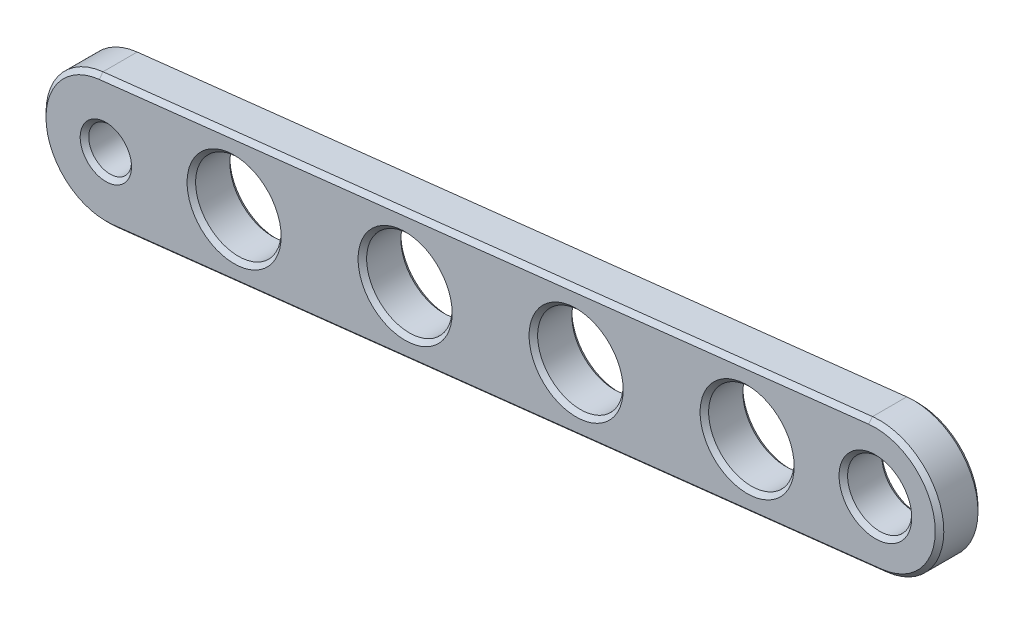
ISO-10303-21;
HEADER;
FILE_DESCRIPTION(('STEP AP214'),'2;1');
FILE_NAME('part.step','',(''),(''),'','','');
FILE_SCHEMA(('AUTOMOTIVE_DESIGN { 1 0 10303 214 1 1 1 1 }'));
ENDSEC;
DATA;
#1=APPLICATION_CONTEXT('core data for automotive mechanical design processes');
#2=APPLICATION_PROTOCOL_DEFINITION('international standard','automotive_design',2000,#1);
#3=PRODUCT_CONTEXT('',#1,'mechanical');
#4=PRODUCT('Part','Part','',(#3));
#5=PRODUCT_RELATED_PRODUCT_CATEGORY('part','',(#4));
#6=PRODUCT_DEFINITION_FORMATION('','',#4);
#7=PRODUCT_DEFINITION_CONTEXT('part definition',#1,'design');
#8=PRODUCT_DEFINITION('design','',#6,#7);
#9=PRODUCT_DEFINITION_SHAPE('','',#8);
#10=(LENGTH_UNIT() NAMED_UNIT(*) SI_UNIT(.MILLI.,.METRE.));
#11=(NAMED_UNIT(*) PLANE_ANGLE_UNIT() SI_UNIT($,.RADIAN.));
#12=(NAMED_UNIT(*) SI_UNIT($,.STERADIAN.) SOLID_ANGLE_UNIT());
#13=UNCERTAINTY_MEASURE_WITH_UNIT(LENGTH_MEASURE(1.E-05),#10,'distance_accuracy_value','');
#14=(GEOMETRIC_REPRESENTATION_CONTEXT(3) GLOBAL_UNCERTAINTY_ASSIGNED_CONTEXT((#13)) GLOBAL_UNIT_ASSIGNED_CONTEXT((#10,
#11,#12)) REPRESENTATION_CONTEXT('',''));
#15=CARTESIAN_POINT('',(0.,0.,0.));
#16=DIRECTION('',(0.,0.,1.));
#17=DIRECTION('',(1.,0.,0.));
#18=AXIS2_PLACEMENT_3D('',#15,#16,#17);
#19=CARTESIAN_POINT('',(145.074626865672,0.,2.));
#20=DIRECTION('',(0.,0.,1.));
#21=DIRECTION('',(1.,0.,0.));
#22=AXIS2_PLACEMENT_3D('',#19,#20,#21);
#23=PLANE('',#22);
#24=CARTESIAN_POINT('',(159.074626865672,1.56716417910449,2.));
#25=DIRECTION('',(0.,0.,1.));
#26=DIRECTION('',(1.,0.,0.));
#27=AXIS2_PLACEMENT_3D('',#24,#25,#26);
#28=CIRCLE('',#27,2.20000000000001);
#29=CARTESIAN_POINT('',(161.274626865672,1.56716417910449,2.));
#30=VERTEX_POINT('',#29);
#31=EDGE_CURVE('E11',#30,#30,#28,.F.);
#32=ORIENTED_EDGE('',*,*,#31,.T.);
#33=EDGE_LOOP('',(#32));
#34=FACE_BOUND('',#33,.T.);
#35=CARTESIAN_POINT('',(175.074626865672,3.3582089552239,2.));
#36=DIRECTION('',(0.,0.,1.));
#37=DIRECTION('',(1.,0.,0.));
#38=AXIS2_PLACEMENT_3D('',#35,#36,#37);
#39=CIRCLE('',#38,2.20000000000001);
#40=CARTESIAN_POINT('',(177.274626865672,3.3582089552239,2.));
#41=VERTEX_POINT('',#40);
#42=EDGE_CURVE('E45',#41,#41,#39,.F.);
#43=ORIENTED_EDGE('',*,*,#42,.T.);
#44=EDGE_LOOP('',(#43));
#45=FACE_BOUND('',#44,.T.);
#46=CARTESIAN_POINT('',(145.074626865672,0.,2.));
#47=DIRECTION('',(0.,0.,1.));
#48=DIRECTION('',(1.,0.,0.));
#49=AXIS2_PLACEMENT_3D('',#46,#47,#48);
#50=CIRCLE('',#49,1.20000000000001);
#51=CARTESIAN_POINT('',(146.274626865672,0.,2.));
#52=VERTEX_POINT('',#51);
#53=EDGE_CURVE('E219',#52,#52,#50,.F.);
#54=ORIENTED_EDGE('',*,*,#53,.T.);
#55=EDGE_LOOP('',(#54));
#56=FACE_BOUND('',#55,.T.);
#57=CARTESIAN_POINT('',(181.074626865672,4.02985074626868,2.));
#58=DIRECTION('',(0.,0.,1.));
#59=DIRECTION('',(1.,0.,0.));
#60=AXIS2_PLACEMENT_3D('',#57,#58,#59);
#61=CIRCLE('',#60,2.79999999999999);
#62=CARTESIAN_POINT('',(181.386114210674,1.24723046424968,2.));
#63=VERTEX_POINT('',#62);
#64=CARTESIAN_POINT('',(180.763139520669,6.81247102828767,2.));
#65=VERTEX_POINT('',#64);
#66=EDGE_CURVE('E53',#63,#65,#61,.T.);
#67=ORIENTED_EDGE('',*,*,#66,.T.);
#68=DIRECTION('',(-0.99379295786393,-0.111245480357903,0.));
#69=VECTOR('',#68,1.);
#70=CARTESIAN_POINT('',(144.76313952067,2.782620282019,2.));
#71=LINE('',#70,#69);
#72=CARTESIAN_POINT('',(144.76313952067,2.78262028201899,2.));
#73=VERTEX_POINT('',#72);
#74=EDGE_CURVE('E217',#65,#73,#71,.T.);
#75=ORIENTED_EDGE('',*,*,#74,.T.);
#76=CARTESIAN_POINT('',(145.074626865672,0.,2.));
#77=DIRECTION('',(0.,0.,1.));
#78=DIRECTION('',(1.,0.,0.));
#79=AXIS2_PLACEMENT_3D('',#76,#77,#78);
#80=CIRCLE('',#79,2.79999999999999);
#81=CARTESIAN_POINT('',(145.386114210674,-2.78262028201899,2.));
#82=VERTEX_POINT('',#81);
#83=EDGE_CURVE('E213',#73,#82,#80,.T.);
#84=ORIENTED_EDGE('',*,*,#83,.T.);
#85=DIRECTION('',(0.99379295786393,0.111245480357903,0.));
#86=VECTOR('',#85,1.);
#87=CARTESIAN_POINT('',(181.386114210674,1.24723046424968,2.));
#88=LINE('',#87,#86);
#89=EDGE_CURVE('E58',#82,#63,#88,.T.);
#90=ORIENTED_EDGE('',*,*,#89,.T.);
#91=EDGE_LOOP('',(#67,#75,#84,#90));
#92=FACE_BOUND('',#91,.T.);
#93=CARTESIAN_POINT('',(181.074626865672,4.02985074626868,2.));
#94=DIRECTION('',(0.,0.,1.));
#95=DIRECTION('',(1.,0.,0.));
#96=AXIS2_PLACEMENT_3D('',#93,#94,#95);
#97=CIRCLE('',#96,1.70000000000001);
#98=CARTESIAN_POINT('',(182.774626865672,4.02985074626868,2.));
#99=VERTEX_POINT('',#98);
#100=EDGE_CURVE('E210',#99,#99,#97,.F.);
#101=ORIENTED_EDGE('',*,*,#100,.T.);
#102=EDGE_LOOP('',(#101));
#103=FACE_BOUND('',#102,.T.);
#104=CARTESIAN_POINT('',(151.074626865672,0.67164179104478,2.));
#105=DIRECTION('',(0.,0.,1.));
#106=DIRECTION('',(1.,0.,0.));
#107=AXIS2_PLACEMENT_3D('',#104,#105,#106);
#108=CIRCLE('',#107,2.20000000000001);
#109=CARTESIAN_POINT('',(153.274626865672,0.67164179104478,2.));
#110=VERTEX_POINT('',#109);
#111=EDGE_CURVE('E207',#110,#110,#108,.F.);
#112=ORIENTED_EDGE('',*,*,#111,.T.);
#113=EDGE_LOOP('',(#112));
#114=FACE_BOUND('',#113,.T.);
#115=CARTESIAN_POINT('',(167.074626865672,2.46268656716419,2.));
#116=DIRECTION('',(0.,0.,1.));
#117=DIRECTION('',(1.,0.,0.));
#118=AXIS2_PLACEMENT_3D('',#115,#116,#117);
#119=CIRCLE('',#118,2.20000000000001);
#120=CARTESIAN_POINT('',(169.274626865672,2.46268656716419,2.));
#121=VERTEX_POINT('',#120);
#122=EDGE_CURVE('E204',#121,#121,#119,.F.);
#123=ORIENTED_EDGE('',*,*,#122,.T.);
#124=EDGE_LOOP('',(#123));
#125=FACE_BOUND('',#124,.T.);
#126=ADVANCED_FACE('F35',(#34,#45,#56,#92,#103,#114,#125),#23,.T.);
#127=CARTESIAN_POINT('',(145.074626865672,0.,0.));
#128=DIRECTION('',(0.,0.,1.));
#129=DIRECTION('',(1.,0.,0.));
#130=AXIS2_PLACEMENT_3D('',#127,#128,#129);
#131=PLANE('',#130);
#132=CARTESIAN_POINT('',(159.074626865672,1.56716417910449,0.));
#133=DIRECTION('',(0.,0.,1.));
#134=DIRECTION('',(1.,0.,0.));
#135=AXIS2_PLACEMENT_3D('',#132,#133,#134);
#136=CIRCLE('',#135,2.20000000000001);
#137=CARTESIAN_POINT('',(161.274626865672,1.56716417910449,0.));
#138=VERTEX_POINT('',#137);
#139=EDGE_CURVE('E149',#138,#138,#136,.T.);
#140=ORIENTED_EDGE('',*,*,#139,.T.);
#141=EDGE_LOOP('',(#140));
#142=FACE_BOUND('',#141,.T.);
#143=CARTESIAN_POINT('',(167.074626865672,2.46268656716419,0.));
#144=DIRECTION('',(0.,0.,1.));
#145=DIRECTION('',(1.,0.,0.));
#146=AXIS2_PLACEMENT_3D('',#143,#144,#145);
#147=CIRCLE('',#146,2.20000000000001);
#148=CARTESIAN_POINT('',(169.274626865672,2.46268656716419,0.));
#149=VERTEX_POINT('',#148);
#150=EDGE_CURVE('E146',#149,#149,#147,.T.);
#151=ORIENTED_EDGE('',*,*,#150,.T.);
#152=EDGE_LOOP('',(#151));
#153=FACE_BOUND('',#152,.T.);
#154=CARTESIAN_POINT('',(175.074626865672,3.3582089552239,0.));
#155=DIRECTION('',(0.,0.,1.));
#156=DIRECTION('',(1.,0.,0.));
#157=AXIS2_PLACEMENT_3D('',#154,#155,#156);
#158=CIRCLE('',#157,2.20000000000001);
#159=CARTESIAN_POINT('',(177.274626865672,3.3582089552239,0.));
#160=VERTEX_POINT('',#159);
#161=EDGE_CURVE('E143',#160,#160,#158,.T.);
#162=ORIENTED_EDGE('',*,*,#161,.T.);
#163=EDGE_LOOP('',(#162));
#164=FACE_BOUND('',#163,.T.);
#165=CARTESIAN_POINT('',(151.074626865672,0.67164179104478,0.));
#166=DIRECTION('',(0.,0.,1.));
#167=DIRECTION('',(1.,0.,0.));
#168=AXIS2_PLACEMENT_3D('',#165,#166,#167);
#169=CIRCLE('',#168,2.20000000000001);
#170=CARTESIAN_POINT('',(153.274626865672,0.67164179104478,0.));
#171=VERTEX_POINT('',#170);
#172=EDGE_CURVE('E140',#171,#171,#169,.T.);
#173=ORIENTED_EDGE('',*,*,#172,.T.);
#174=EDGE_LOOP('',(#173));
#175=FACE_BOUND('',#174,.T.);
#176=CARTESIAN_POINT('',(145.074626865672,0.,0.));
#177=DIRECTION('',(0.,0.,1.));
#178=DIRECTION('',(1.,0.,0.));
#179=AXIS2_PLACEMENT_3D('',#176,#177,#178);
#180=CIRCLE('',#179,1.20000000000001);
#181=CARTESIAN_POINT('',(146.274626865672,0.,0.));
#182=VERTEX_POINT('',#181);
#183=EDGE_CURVE('E133',#182,#182,#180,.T.);
#184=ORIENTED_EDGE('',*,*,#183,.T.);
#185=EDGE_LOOP('',(#184));
#186=FACE_BOUND('',#185,.T.);
#187=CARTESIAN_POINT('',(181.074626865672,4.02985074626868,0.));
#188=DIRECTION('',(0.,0.,1.));
#189=DIRECTION('',(1.,0.,0.));
#190=AXIS2_PLACEMENT_3D('',#187,#188,#189);
#191=CIRCLE('',#190,1.70000000000001);
#192=CARTESIAN_POINT('',(182.774626865672,4.02985074626868,0.));
#193=VERTEX_POINT('',#192);
#194=EDGE_CURVE('E130',#193,#193,#191,.T.);
#195=ORIENTED_EDGE('',*,*,#194,.T.);
#196=EDGE_LOOP('',(#195));
#197=FACE_BOUND('',#196,.T.);
#198=CARTESIAN_POINT('',(181.074626865672,4.02985074626868,0.));
#199=DIRECTION('',(0.,0.,1.));
#200=DIRECTION('',(1.,0.,0.));
#201=AXIS2_PLACEMENT_3D('',#198,#199,#200);
#202=CIRCLE('',#201,2.79999999999999);
#203=CARTESIAN_POINT('',(180.763139520669,6.81247102828768,0.));
#204=VERTEX_POINT('',#203);
#205=CARTESIAN_POINT('',(181.386114210674,1.24723046424968,0.));
#206=VERTEX_POINT('',#205);
#207=EDGE_CURVE('E129',#204,#206,#202,.F.);
#208=ORIENTED_EDGE('',*,*,#207,.T.);
#209=DIRECTION('',(-0.99379295786393,-0.111245480357903,0.));
#210=VECTOR('',#209,1.);
#211=CARTESIAN_POINT('',(145.386114210674,-2.782620282019,0.));
#212=LINE('',#211,#210);
#213=CARTESIAN_POINT('',(145.386114210674,-2.78262028201899,0.));
#214=VERTEX_POINT('',#213);
#215=EDGE_CURVE('E108',#206,#214,#212,.T.);
#216=ORIENTED_EDGE('',*,*,#215,.T.);
#217=CARTESIAN_POINT('',(145.074626865672,0.,0.));
#218=DIRECTION('',(0.,0.,1.));
#219=DIRECTION('',(1.,0.,0.));
#220=AXIS2_PLACEMENT_3D('',#217,#218,#219);
#221=CIRCLE('',#220,2.79999999999999);
#222=CARTESIAN_POINT('',(144.76313952067,2.78262028201899,0.));
#223=VERTEX_POINT('',#222);
#224=EDGE_CURVE('E118',#214,#223,#221,.F.);
#225=ORIENTED_EDGE('',*,*,#224,.T.);
#226=DIRECTION('',(0.99379295786393,0.111245480357903,0.));
#227=VECTOR('',#226,1.);
#228=CARTESIAN_POINT('',(144.76313952067,2.782620282019,0.));
#229=LINE('',#228,#227);
#230=EDGE_CURVE('E124',#223,#204,#229,.T.);
#231=ORIENTED_EDGE('',*,*,#230,.T.);
#232=EDGE_LOOP('',(#208,#216,#225,#231));
#233=FACE_BOUND('',#232,.T.);
#234=ADVANCED_FACE('F127',(#142,#153,#164,#175,#186,#197,#233),#131,.F.);
#235=CARTESIAN_POINT('',(145.074626865672,0.,2.));
#236=DIRECTION('',(0.,0.,-1.));
#237=DIRECTION('',(-1.,0.,0.));
#238=AXIS2_PLACEMENT_3D('',#235,#236,#237);
#239=CYLINDRICAL_SURFACE('',#238,2.99999999999999);
#240=DIRECTION('',(0.,0.,-1.));
#241=VECTOR('',#240,1.);
#242=CARTESIAN_POINT('',(144.740890424598,2.98137887359178,2.));
#243=LINE('',#242,#241);
#244=CARTESIAN_POINT('',(144.740890424598,2.98137887359178,1.80000000000001));
#245=VERTEX_POINT('',#244);
#246=CARTESIAN_POINT('',(144.740890424598,2.98137887359178,0.199999999999995));
#247=VERTEX_POINT('',#246);
#248=EDGE_CURVE('E228',#245,#247,#243,.T.);
#249=ORIENTED_EDGE('',*,*,#248,.T.);
#250=CARTESIAN_POINT('',(145.074626865672,0.,0.199999999999995));
#251=DIRECTION('',(0.,0.,1.));
#252=DIRECTION('',(1.,0.,0.));
#253=AXIS2_PLACEMENT_3D('',#250,#251,#252);
#254=CIRCLE('',#253,2.99999999999999);
#255=CARTESIAN_POINT('',(145.408363306745,-2.98137887359177,0.199999999999995));
#256=VERTEX_POINT('',#255);
#257=EDGE_CURVE('E202',#247,#256,#254,.T.);
#258=ORIENTED_EDGE('',*,*,#257,.T.);
#259=DIRECTION('',(0.,0.,-1.));
#260=VECTOR('',#259,1.);
#261=CARTESIAN_POINT('',(145.408363306745,-2.98137887359177,2.));
#262=LINE('',#261,#260);
#263=CARTESIAN_POINT('',(145.408363306745,-2.98137887359177,1.80000000000001));
#264=VERTEX_POINT('',#263);
#265=EDGE_CURVE('E125',#264,#256,#262,.T.);
#266=ORIENTED_EDGE('',*,*,#265,.F.);
#267=CARTESIAN_POINT('',(145.074626865672,0.,1.80000000000001));
#268=DIRECTION('',(0.,0.,1.));
#269=DIRECTION('',(1.,0.,0.));
#270=AXIS2_PLACEMENT_3D('',#267,#268,#269);
#271=CIRCLE('',#270,2.99999999999999);
#272=EDGE_CURVE('E200',#264,#245,#271,.F.);
#273=ORIENTED_EDGE('',*,*,#272,.T.);
#274=EDGE_LOOP('',(#249,#258,#266,#273));
#275=FACE_BOUND('',#274,.T.);
#276=ADVANCED_FACE('F254',(#275),#239,.T.);
#277=CARTESIAN_POINT('',(145.408363306745,-2.98137887359177,2.));
#278=DIRECTION('',(-0.111245480357903,0.99379295786393,0.));
#279=DIRECTION('',(-0.99379295786393,-0.111245480357903,0.));
#280=AXIS2_PLACEMENT_3D('',#277,#278,#279);
#281=PLANE('',#280);
#282=ORIENTED_EDGE('',*,*,#265,.T.);
#283=DIRECTION('',(0.99379295786393,0.111245480357903,0.));
#284=VECTOR('',#283,1.);
#285=CARTESIAN_POINT('',(145.408363306745,-2.98137887359177,0.199999999999996));
#286=LINE('',#285,#284);
#287=CARTESIAN_POINT('',(181.408363306745,1.0484718726769,0.199999999999995));
#288=VERTEX_POINT('',#287);
#289=EDGE_CURVE('E111',#256,#288,#286,.T.);
#290=ORIENTED_EDGE('',*,*,#289,.T.);
#291=DIRECTION('',(0.,0.,-1.));
#292=VECTOR('',#291,1.);
#293=CARTESIAN_POINT('',(181.408363306745,1.0484718726769,2.));
#294=LINE('',#293,#292);
#295=CARTESIAN_POINT('',(181.408363306745,1.0484718726769,1.80000000000001));
#296=VERTEX_POINT('',#295);
#297=EDGE_CURVE('E251',#296,#288,#294,.T.);
#298=ORIENTED_EDGE('',*,*,#297,.F.);
#299=DIRECTION('',(-0.99379295786393,-0.111245480357903,0.));
#300=VECTOR('',#299,1.);
#301=CARTESIAN_POINT('',(145.408363306745,-2.98137887359177,1.80000000000001));
#302=LINE('',#301,#300);
#303=EDGE_CURVE('E188',#296,#264,#302,.T.);
#304=ORIENTED_EDGE('',*,*,#303,.T.);
#305=EDGE_LOOP('',(#282,#290,#298,#304));
#306=FACE_BOUND('',#305,.T.);
#307=ADVANCED_FACE('F249',(#306),#281,.F.);
#308=CARTESIAN_POINT('',(181.074626865672,4.02985074626868,2.));
#309=DIRECTION('',(0.,0.,-1.));
#310=DIRECTION('',(-1.,0.,0.));
#311=AXIS2_PLACEMENT_3D('',#308,#309,#310);
#312=CYLINDRICAL_SURFACE('',#311,2.99999999999999);
#313=ORIENTED_EDGE('',*,*,#297,.T.);
#314=CARTESIAN_POINT('',(181.074626865672,4.02985074626868,0.199999999999995));
#315=DIRECTION('',(0.,0.,1.));
#316=DIRECTION('',(1.,0.,0.));
#317=AXIS2_PLACEMENT_3D('',#314,#315,#316);
#318=CIRCLE('',#317,2.99999999999999);
#319=CARTESIAN_POINT('',(180.740890424598,7.01122961986046,0.199999999999995));
#320=VERTEX_POINT('',#319);
#321=EDGE_CURVE('E193',#288,#320,#318,.T.);
#322=ORIENTED_EDGE('',*,*,#321,.T.);
#323=DIRECTION('',(0.,0.,-1.));
#324=VECTOR('',#323,1.);
#325=CARTESIAN_POINT('',(180.740890424598,7.01122961986046,2.));
#326=LINE('',#325,#324);
#327=CARTESIAN_POINT('',(180.740890424598,7.01122961986046,1.80000000000001));
#328=VERTEX_POINT('',#327);
#329=EDGE_CURVE('E257',#328,#320,#326,.T.);
#330=ORIENTED_EDGE('',*,*,#329,.F.);
#331=CARTESIAN_POINT('',(181.074626865672,4.02985074626868,1.80000000000001));
#332=DIRECTION('',(0.,0.,1.));
#333=DIRECTION('',(1.,0.,0.));
#334=AXIS2_PLACEMENT_3D('',#331,#332,#333);
#335=CIRCLE('',#334,2.99999999999999);
#336=EDGE_CURVE('E191',#328,#296,#335,.F.);
#337=ORIENTED_EDGE('',*,*,#336,.T.);
#338=EDGE_LOOP('',(#313,#322,#330,#337));
#339=FACE_BOUND('',#338,.T.);
#340=ADVANCED_FACE('F270',(#339),#312,.T.);
#341=CARTESIAN_POINT('',(144.740890424598,2.98137887359178,2.));
#342=DIRECTION('',(0.111245480357903,-0.99379295786393,0.));
#343=DIRECTION('',(0.99379295786393,0.111245480357903,0.));
#344=AXIS2_PLACEMENT_3D('',#341,#342,#343);
#345=PLANE('',#344);
#346=ORIENTED_EDGE('',*,*,#329,.T.);
#347=DIRECTION('',(-0.99379295786393,-0.111245480357903,0.));
#348=VECTOR('',#347,1.);
#349=CARTESIAN_POINT('',(144.740890424598,2.98137887359178,0.199999999999995));
#350=LINE('',#349,#348);
#351=EDGE_CURVE('E198',#320,#247,#350,.T.);
#352=ORIENTED_EDGE('',*,*,#351,.T.);
#353=ORIENTED_EDGE('',*,*,#248,.F.);
#354=DIRECTION('',(0.99379295786393,0.111245480357903,0.));
#355=VECTOR('',#354,1.);
#356=CARTESIAN_POINT('',(180.740890424598,7.01122961986046,1.80000000000001));
#357=LINE('',#356,#355);
#358=EDGE_CURVE('E195',#245,#328,#357,.T.);
#359=ORIENTED_EDGE('',*,*,#358,.T.);
#360=EDGE_LOOP('',(#346,#352,#353,#359));
#361=FACE_BOUND('',#360,.T.);
#362=ADVANCED_FACE('F274',(#361),#345,.F.);
#363=CARTESIAN_POINT('',(181.074626865672,4.02985074626868,2.));
#364=DIRECTION('',(0.,0.,-1.));
#365=DIRECTION('',(-1.,0.,0.));
#366=AXIS2_PLACEMENT_3D('',#363,#364,#365);
#367=CYLINDRICAL_SURFACE('',#366,1.5);
#368=CARTESIAN_POINT('',(181.074626865672,4.02985074626868,0.200000000000008));
#369=DIRECTION('',(0.,0.,1.));
#370=DIRECTION('',(1.,0.,0.));
#371=AXIS2_PLACEMENT_3D('',#368,#369,#370);
#372=CIRCLE('',#371,1.5);
#373=CARTESIAN_POINT('',(182.574626865672,4.02985074626868,0.200000000000008));
#374=VERTEX_POINT('',#373);
#375=EDGE_CURVE('E185',#374,#374,#372,.F.);
#376=ORIENTED_EDGE('',*,*,#375,.T.);
#377=EDGE_LOOP('',(#376));
#378=FACE_BOUND('',#377,.T.);
#379=CARTESIAN_POINT('',(181.074626865672,4.02985074626868,1.8));
#380=DIRECTION('',(0.,0.,1.));
#381=DIRECTION('',(1.,0.,0.));
#382=AXIS2_PLACEMENT_3D('',#379,#380,#381);
#383=CIRCLE('',#382,1.5);
#384=CARTESIAN_POINT('',(182.574626865672,4.02985074626868,1.8));
#385=VERTEX_POINT('',#384);
#386=EDGE_CURVE('E182',#385,#385,#383,.T.);
#387=ORIENTED_EDGE('',*,*,#386,.T.);
#388=EDGE_LOOP('',(#387));
#389=FACE_BOUND('',#388,.T.);
#390=ADVANCED_FACE('F318',(#378,#389),#367,.F.);
#391=CARTESIAN_POINT('',(145.074626865672,0.,2.));
#392=DIRECTION('',(0.,0.,-1.));
#393=DIRECTION('',(-1.,0.,0.));
#394=AXIS2_PLACEMENT_3D('',#391,#392,#393);
#395=CYLINDRICAL_SURFACE('',#394,0.999999999999998);
#396=CARTESIAN_POINT('',(145.074626865672,0.,0.200000000000009));
#397=DIRECTION('',(0.,0.,1.));
#398=DIRECTION('',(1.,0.,0.));
#399=AXIS2_PLACEMENT_3D('',#396,#397,#398);
#400=CIRCLE('',#399,0.999999999999998);
#401=CARTESIAN_POINT('',(146.074626865672,0.,0.200000000000009));
#402=VERTEX_POINT('',#401);
#403=EDGE_CURVE('E179',#402,#402,#400,.F.);
#404=ORIENTED_EDGE('',*,*,#403,.T.);
#405=EDGE_LOOP('',(#404));
#406=FACE_BOUND('',#405,.T.);
#407=CARTESIAN_POINT('',(145.074626865672,0.,1.79999999999999));
#408=DIRECTION('',(0.,0.,1.));
#409=DIRECTION('',(1.,0.,0.));
#410=AXIS2_PLACEMENT_3D('',#407,#408,#409);
#411=CIRCLE('',#410,0.999999999999998);
#412=CARTESIAN_POINT('',(146.074626865672,0.,1.79999999999999));
#413=VERTEX_POINT('',#412);
#414=EDGE_CURVE('E176',#413,#413,#411,.T.);
#415=ORIENTED_EDGE('',*,*,#414,.T.);
#416=EDGE_LOOP('',(#415));
#417=FACE_BOUND('',#416,.T.);
#418=ADVANCED_FACE('F314',(#406,#417),#395,.F.);
#419=CARTESIAN_POINT('',(151.074626865672,0.67164179104478,2.));
#420=DIRECTION('',(0.,0.,-1.));
#421=DIRECTION('',(-1.,0.,0.));
#422=AXIS2_PLACEMENT_3D('',#419,#420,#421);
#423=CYLINDRICAL_SURFACE('',#422,2.);
#424=CARTESIAN_POINT('',(151.074626865672,0.67164179104478,0.200000000000008));
#425=DIRECTION('',(0.,0.,1.));
#426=DIRECTION('',(1.,0.,0.));
#427=AXIS2_PLACEMENT_3D('',#424,#425,#426);
#428=CIRCLE('',#427,2.);
#429=CARTESIAN_POINT('',(153.074626865672,0.67164179104478,0.200000000000008));
#430=VERTEX_POINT('',#429);
#431=EDGE_CURVE('E173',#430,#430,#428,.F.);
#432=ORIENTED_EDGE('',*,*,#431,.T.);
#433=EDGE_LOOP('',(#432));
#434=FACE_BOUND('',#433,.T.);
#435=CARTESIAN_POINT('',(151.074626865672,0.67164179104478,1.79999999999999));
#436=DIRECTION('',(0.,0.,1.));
#437=DIRECTION('',(1.,0.,0.));
#438=AXIS2_PLACEMENT_3D('',#435,#436,#437);
#439=CIRCLE('',#438,2.);
#440=CARTESIAN_POINT('',(153.074626865672,0.67164179104478,1.79999999999999));
#441=VERTEX_POINT('',#440);
#442=EDGE_CURVE('E170',#441,#441,#439,.T.);
#443=ORIENTED_EDGE('',*,*,#442,.T.);
#444=EDGE_LOOP('',(#443));
#445=FACE_BOUND('',#444,.T.);
#446=ADVANCED_FACE('F308',(#434,#445),#423,.F.);
#447=CARTESIAN_POINT('',(175.074626865672,3.3582089552239,2.));
#448=DIRECTION('',(0.,0.,-1.));
#449=DIRECTION('',(-1.,0.,0.));
#450=AXIS2_PLACEMENT_3D('',#447,#448,#449);
#451=CYLINDRICAL_SURFACE('',#450,2.);
#452=CARTESIAN_POINT('',(175.074626865672,3.3582089552239,0.200000000000008));
#453=DIRECTION('',(0.,0.,1.));
#454=DIRECTION('',(1.,0.,0.));
#455=AXIS2_PLACEMENT_3D('',#452,#453,#454);
#456=CIRCLE('',#455,2.);
#457=CARTESIAN_POINT('',(177.074626865672,3.3582089552239,0.200000000000008));
#458=VERTEX_POINT('',#457);
#459=EDGE_CURVE('E167',#458,#458,#456,.F.);
#460=ORIENTED_EDGE('',*,*,#459,.T.);
#461=EDGE_LOOP('',(#460));
#462=FACE_BOUND('',#461,.T.);
#463=CARTESIAN_POINT('',(175.074626865672,3.3582089552239,1.8));
#464=DIRECTION('',(0.,0.,1.));
#465=DIRECTION('',(1.,0.,0.));
#466=AXIS2_PLACEMENT_3D('',#463,#464,#465);
#467=CIRCLE('',#466,2.);
#468=CARTESIAN_POINT('',(177.074626865672,3.3582089552239,1.8));
#469=VERTEX_POINT('',#468);
#470=EDGE_CURVE('E164',#469,#469,#467,.T.);
#471=ORIENTED_EDGE('',*,*,#470,.T.);
#472=EDGE_LOOP('',(#471));
#473=FACE_BOUND('',#472,.T.);
#474=ADVANCED_FACE('F298',(#462,#473),#451,.F.);
#475=CARTESIAN_POINT('',(167.074626865672,2.46268656716419,2.));
#476=DIRECTION('',(0.,0.,-1.));
#477=DIRECTION('',(-1.,0.,0.));
#478=AXIS2_PLACEMENT_3D('',#475,#476,#477);
#479=CYLINDRICAL_SURFACE('',#478,2.);
#480=CARTESIAN_POINT('',(167.074626865672,2.46268656716419,0.200000000000008));
#481=DIRECTION('',(0.,0.,1.));
#482=DIRECTION('',(1.,0.,0.));
#483=AXIS2_PLACEMENT_3D('',#480,#481,#482);
#484=CIRCLE('',#483,2.);
#485=CARTESIAN_POINT('',(169.074626865672,2.46268656716419,0.200000000000008));
#486=VERTEX_POINT('',#485);
#487=EDGE_CURVE('E161',#486,#486,#484,.F.);
#488=ORIENTED_EDGE('',*,*,#487,.T.);
#489=EDGE_LOOP('',(#488));
#490=FACE_BOUND('',#489,.T.);
#491=CARTESIAN_POINT('',(167.074626865672,2.46268656716419,1.8));
#492=DIRECTION('',(0.,0.,1.));
#493=DIRECTION('',(1.,0.,0.));
#494=AXIS2_PLACEMENT_3D('',#491,#492,#493);
#495=CIRCLE('',#494,2.);
#496=CARTESIAN_POINT('',(169.074626865672,2.46268656716419,1.8));
#497=VERTEX_POINT('',#496);
#498=EDGE_CURVE('E158',#497,#497,#495,.T.);
#499=ORIENTED_EDGE('',*,*,#498,.T.);
#500=EDGE_LOOP('',(#499));
#501=FACE_BOUND('',#500,.T.);
#502=ADVANCED_FACE('F295',(#490,#501),#479,.F.);
#503=CARTESIAN_POINT('',(159.074626865672,1.56716417910449,2.));
#504=DIRECTION('',(0.,0.,-1.));
#505=DIRECTION('',(-1.,0.,0.));
#506=AXIS2_PLACEMENT_3D('',#503,#504,#505);
#507=CYLINDRICAL_SURFACE('',#506,2.);
#508=CARTESIAN_POINT('',(159.074626865672,1.56716417910449,0.200000000000008));
#509=DIRECTION('',(0.,0.,1.));
#510=DIRECTION('',(1.,0.,0.));
#511=AXIS2_PLACEMENT_3D('',#508,#509,#510);
#512=CIRCLE('',#511,2.);
#513=CARTESIAN_POINT('',(161.074626865672,1.56716417910449,0.200000000000008));
#514=VERTEX_POINT('',#513);
#515=EDGE_CURVE('E155',#514,#514,#512,.F.);
#516=ORIENTED_EDGE('',*,*,#515,.T.);
#517=EDGE_LOOP('',(#516));
#518=FACE_BOUND('',#517,.T.);
#519=CARTESIAN_POINT('',(159.074626865672,1.56716417910449,1.8));
#520=DIRECTION('',(0.,0.,1.));
#521=DIRECTION('',(1.,0.,0.));
#522=AXIS2_PLACEMENT_3D('',#519,#520,#521);
#523=CIRCLE('',#522,2.);
#524=CARTESIAN_POINT('',(161.074626865672,1.56716417910449,1.8));
#525=VERTEX_POINT('',#524);
#526=EDGE_CURVE('E152',#525,#525,#523,.T.);
#527=ORIENTED_EDGE('',*,*,#526,.T.);
#528=EDGE_LOOP('',(#527));
#529=FACE_BOUND('',#528,.T.);
#530=ADVANCED_FACE('F297',(#518,#529),#507,.F.);
#531=CARTESIAN_POINT('',(159.074626865672,1.56716417910449,0.));
#532=DIRECTION('',(0.,0.,-1.));
#533=DIRECTION('',(-1.,0.,0.));
#534=AXIS2_PLACEMENT_3D('',#531,#532,#533);
#535=CONICAL_SURFACE('',#534,2.20000000000001,0.785398163397457);
#536=ORIENTED_EDGE('',*,*,#515,.F.);
#537=EDGE_LOOP('',(#536));
#538=FACE_BOUND('',#537,.T.);
#539=ORIENTED_EDGE('',*,*,#139,.F.);
#540=EDGE_LOOP('',(#539));
#541=FACE_BOUND('',#540,.T.);
#542=ADVANCED_FACE('F305',(#538,#541),#535,.F.);
#543=CARTESIAN_POINT('',(167.074626865672,2.46268656716419,0.));
#544=DIRECTION('',(0.,0.,-1.));
#545=DIRECTION('',(-1.,0.,0.));
#546=AXIS2_PLACEMENT_3D('',#543,#544,#545);
#547=CONICAL_SURFACE('',#546,2.20000000000001,0.785398163397457);
#548=ORIENTED_EDGE('',*,*,#487,.F.);
#549=EDGE_LOOP('',(#548));
#550=FACE_BOUND('',#549,.T.);
#551=ORIENTED_EDGE('',*,*,#150,.F.);
#552=EDGE_LOOP('',(#551));
#553=FACE_BOUND('',#552,.T.);
#554=ADVANCED_FACE('F340',(#550,#553),#547,.F.);
#555=CARTESIAN_POINT('',(175.074626865672,3.3582089552239,0.));
#556=DIRECTION('',(0.,0.,-1.));
#557=DIRECTION('',(-1.,0.,0.));
#558=AXIS2_PLACEMENT_3D('',#555,#556,#557);
#559=CONICAL_SURFACE('',#558,2.20000000000001,0.785398163397457);
#560=ORIENTED_EDGE('',*,*,#459,.F.);
#561=EDGE_LOOP('',(#560));
#562=FACE_BOUND('',#561,.T.);
#563=ORIENTED_EDGE('',*,*,#161,.F.);
#564=EDGE_LOOP('',(#563));
#565=FACE_BOUND('',#564,.T.);
#566=ADVANCED_FACE('F347',(#562,#565),#559,.F.);
#567=CARTESIAN_POINT('',(151.074626865672,0.67164179104478,0.));
#568=DIRECTION('',(0.,0.,-1.));
#569=DIRECTION('',(-1.,0.,0.));
#570=AXIS2_PLACEMENT_3D('',#567,#568,#569);
#571=CONICAL_SURFACE('',#570,2.20000000000001,0.785398163397457);
#572=ORIENTED_EDGE('',*,*,#431,.F.);
#573=EDGE_LOOP('',(#572));
#574=FACE_BOUND('',#573,.T.);
#575=ORIENTED_EDGE('',*,*,#172,.F.);
#576=EDGE_LOOP('',(#575));
#577=FACE_BOUND('',#576,.T.);
#578=ADVANCED_FACE('F354',(#574,#577),#571,.F.);
#579=CARTESIAN_POINT('',(145.074626865672,0.,0.));
#580=DIRECTION('',(0.,0.,-1.));
#581=DIRECTION('',(-1.,0.,0.));
#582=AXIS2_PLACEMENT_3D('',#579,#580,#581);
#583=CONICAL_SURFACE('',#582,1.20000000000001,0.785398163397448);
#584=ORIENTED_EDGE('',*,*,#403,.F.);
#585=EDGE_LOOP('',(#584));
#586=FACE_BOUND('',#585,.T.);
#587=ORIENTED_EDGE('',*,*,#183,.F.);
#588=EDGE_LOOP('',(#587));
#589=FACE_BOUND('',#588,.T.);
#590=ADVANCED_FACE('F361',(#586,#589),#583,.F.);
#591=CARTESIAN_POINT('',(181.074626865672,4.02985074626868,0.));
#592=DIRECTION('',(0.,0.,-1.));
#593=DIRECTION('',(-1.,0.,0.));
#594=AXIS2_PLACEMENT_3D('',#591,#592,#593);
#595=CONICAL_SURFACE('',#594,1.70000000000001,0.785398163397452);
#596=ORIENTED_EDGE('',*,*,#375,.F.);
#597=EDGE_LOOP('',(#596));
#598=FACE_BOUND('',#597,.T.);
#599=ORIENTED_EDGE('',*,*,#194,.F.);
#600=EDGE_LOOP('',(#599));
#601=FACE_BOUND('',#600,.T.);
#602=ADVANCED_FACE('F368',(#598,#601),#595,.F.);
#603=CARTESIAN_POINT('',(144.740890424598,2.98137887359178,0.199999999999995));
#604=DIRECTION('',(0.0786624335374285,-0.702717739601023,0.707106781186546));
#605=DIRECTION('',(-0.99379295786393,-0.111245480357903,0.));
#606=AXIS2_PLACEMENT_3D('',#603,#604,#605);
#607=PLANE('',#606);
#608=DIRECTION('',(-0.0786624335373901,0.702717739601026,0.707106781186548));
#609=VECTOR('',#608,1.);
#610=CARTESIAN_POINT('',(180.763139520669,6.81247102828768,0.));
#611=LINE('',#610,#609);
#612=EDGE_CURVE('E114',#204,#320,#611,.T.);
#613=ORIENTED_EDGE('',*,*,#612,.F.);
#614=ORIENTED_EDGE('',*,*,#230,.F.);
#615=DIRECTION('',(0.0786624335373901,-0.702717739601026,-0.707106781186548));
#616=VECTOR('',#615,1.);
#617=CARTESIAN_POINT('',(144.740890424598,2.98137887359178,0.199999999999995));
#618=LINE('',#617,#616);
#619=EDGE_CURVE('E121',#247,#223,#618,.T.);
#620=ORIENTED_EDGE('',*,*,#619,.F.);
#621=ORIENTED_EDGE('',*,*,#351,.F.);
#622=EDGE_LOOP('',(#613,#614,#620,#621));
#623=FACE_BOUND('',#622,.T.);
#624=ADVANCED_FACE('F263',(#623),#607,.F.);
#625=CARTESIAN_POINT('',(145.074626865672,0.,0.199999999999995));
#626=DIRECTION('',(0.,0.,1.));
#627=DIRECTION('',(1.,0.,0.));
#628=AXIS2_PLACEMENT_3D('',#625,#626,#627);
#629=CONICAL_SURFACE('',#628,2.99999999999999,0.785398163397454);
#630=ORIENTED_EDGE('',*,*,#619,.T.);
#631=ORIENTED_EDGE('',*,*,#224,.F.);
#632=DIRECTION('',(-0.0786624335373897,0.70271773960103,-0.707106781186544));
#633=VECTOR('',#632,1.);
#634=CARTESIAN_POINT('',(145.408363306745,-2.98137887359178,0.199999999999995));
#635=LINE('',#634,#633);
#636=EDGE_CURVE('E104',#256,#214,#635,.T.);
#637=ORIENTED_EDGE('',*,*,#636,.F.);
#638=ORIENTED_EDGE('',*,*,#257,.F.);
#639=EDGE_LOOP('',(#630,#631,#637,#638));
#640=FACE_BOUND('',#639,.T.);
#641=ADVANCED_FACE('F119',(#640),#629,.T.);
#642=CARTESIAN_POINT('',(181.074626865672,4.02985074626868,0.199999999999995));
#643=DIRECTION('',(0.,0.,1.));
#644=DIRECTION('',(1.,0.,0.));
#645=AXIS2_PLACEMENT_3D('',#642,#643,#644);
#646=CONICAL_SURFACE('',#645,2.99999999999999,0.785398163397455);
#647=ORIENTED_EDGE('',*,*,#612,.T.);
#648=ORIENTED_EDGE('',*,*,#321,.F.);
#649=DIRECTION('',(0.0786624335373896,-0.70271773960103,0.707106781186543));
#650=VECTOR('',#649,1.);
#651=CARTESIAN_POINT('',(181.386114210674,1.24723046424968,0.));
#652=LINE('',#651,#650);
#653=EDGE_CURVE('E115',#206,#288,#652,.T.);
#654=ORIENTED_EDGE('',*,*,#653,.F.);
#655=ORIENTED_EDGE('',*,*,#207,.F.);
#656=EDGE_LOOP('',(#647,#648,#654,#655));
#657=FACE_BOUND('',#656,.T.);
#658=ADVANCED_FACE('F266',(#657),#646,.T.);
#659=CARTESIAN_POINT('',(145.408363306745,-2.98137887359177,0.199999999999995));
#660=DIRECTION('',(-0.0786624335374285,0.702717739601023,0.707106781186546));
#661=DIRECTION('',(0.99379295786393,0.111245480357903,0.));
#662=AXIS2_PLACEMENT_3D('',#659,#660,#661);
#663=PLANE('',#662);
#664=ORIENTED_EDGE('',*,*,#636,.T.);
#665=ORIENTED_EDGE('',*,*,#215,.F.);
#666=ORIENTED_EDGE('',*,*,#653,.T.);
#667=ORIENTED_EDGE('',*,*,#289,.F.);
#668=EDGE_LOOP('',(#664,#665,#666,#667));
#669=FACE_BOUND('',#668,.T.);
#670=ADVANCED_FACE('F106',(#669),#663,.F.);
#671=CARTESIAN_POINT('',(159.074626865672,1.56716417910449,1.8));
#672=DIRECTION('',(0.,0.,1.));
#673=DIRECTION('',(1.,0.,0.));
#674=AXIS2_PLACEMENT_3D('',#671,#672,#673);
#675=CONICAL_SURFACE('',#674,2.,0.785398163397474);
#676=ORIENTED_EDGE('',*,*,#31,.F.);
#677=EDGE_LOOP('',(#676));
#678=FACE_BOUND('',#677,.T.);
#679=ORIENTED_EDGE('',*,*,#526,.F.);
#680=EDGE_LOOP('',(#679));
#681=FACE_BOUND('',#680,.T.);
#682=ADVANCED_FACE('F383',(#678,#681),#675,.F.);
#683=CARTESIAN_POINT('',(175.074626865672,3.3582089552239,1.8));
#684=DIRECTION('',(0.,0.,1.));
#685=DIRECTION('',(1.,0.,0.));
#686=AXIS2_PLACEMENT_3D('',#683,#684,#685);
#687=CONICAL_SURFACE('',#686,2.,0.785398163397474);
#688=ORIENTED_EDGE('',*,*,#42,.F.);
#689=EDGE_LOOP('',(#688));
#690=FACE_BOUND('',#689,.T.);
#691=ORIENTED_EDGE('',*,*,#470,.F.);
#692=EDGE_LOOP('',(#691));
#693=FACE_BOUND('',#692,.T.);
#694=ADVANCED_FACE('F402',(#690,#693),#687,.F.);
#695=CARTESIAN_POINT('',(145.074626865672,0.,1.79999999999999));
#696=DIRECTION('',(0.,0.,1.));
#697=DIRECTION('',(1.,0.,0.));
#698=AXIS2_PLACEMENT_3D('',#695,#696,#697);
#699=CONICAL_SURFACE('',#698,0.999999999999998,0.785398163397453);
#700=ORIENTED_EDGE('',*,*,#53,.F.);
#701=EDGE_LOOP('',(#700));
#702=FACE_BOUND('',#701,.T.);
#703=ORIENTED_EDGE('',*,*,#414,.F.);
#704=EDGE_LOOP('',(#703));
#705=FACE_BOUND('',#704,.T.);
#706=ADVANCED_FACE('F409',(#702,#705),#699,.F.);
#707=CARTESIAN_POINT('',(145.386114210674,-2.78262028201899,2.));
#708=DIRECTION('',(0.0786624335374271,-0.702717739601011,0.707106781186559));
#709=DIRECTION('',(-0.99379295786393,-0.111245480357903,0.));
#710=AXIS2_PLACEMENT_3D('',#707,#708,#709);
#711=PLANE('',#710);
#712=DIRECTION('',(-0.0786624335373914,0.702717739601037,0.707106781186536));
#713=VECTOR('',#712,1.);
#714=CARTESIAN_POINT('',(145.408363306745,-2.98137887359177,1.80000000000001));
#715=LINE('',#714,#713);
#716=EDGE_CURVE('E232',#264,#82,#715,.T.);
#717=ORIENTED_EDGE('',*,*,#716,.F.);
#718=ORIENTED_EDGE('',*,*,#303,.F.);
#719=DIRECTION('',(0.0786624335373914,-0.702717739601037,-0.707106781186536));
#720=VECTOR('',#719,1.);
#721=CARTESIAN_POINT('',(181.386114210674,1.24723046424968,2.));
#722=LINE('',#721,#720);
#723=EDGE_CURVE('E40',#63,#296,#722,.T.);
#724=ORIENTED_EDGE('',*,*,#723,.F.);
#725=ORIENTED_EDGE('',*,*,#89,.F.);
#726=EDGE_LOOP('',(#717,#718,#724,#725));
#727=FACE_BOUND('',#726,.T.);
#728=ADVANCED_FACE('F244',(#727),#711,.T.);
#729=CARTESIAN_POINT('',(181.074626865672,4.02985074626868,2.));
#730=DIRECTION('',(0.,0.,-1.));
#731=DIRECTION('',(-1.,0.,0.));
#732=AXIS2_PLACEMENT_3D('',#729,#730,#731);
#733=CONICAL_SURFACE('',#732,2.79999999999999,0.785398163397471);
#734=ORIENTED_EDGE('',*,*,#723,.T.);
#735=ORIENTED_EDGE('',*,*,#336,.F.);
#736=DIRECTION('',(-0.0786624335373909,0.702717739601042,-0.707106781186532));
#737=VECTOR('',#736,1.);
#738=CARTESIAN_POINT('',(180.763139520669,6.81247102828767,2.));
#739=LINE('',#738,#737);
#740=EDGE_CURVE('E231',#65,#328,#739,.T.);
#741=ORIENTED_EDGE('',*,*,#740,.F.);
#742=ORIENTED_EDGE('',*,*,#66,.F.);
#743=EDGE_LOOP('',(#734,#735,#741,#742));
#744=FACE_BOUND('',#743,.T.);
#745=ADVANCED_FACE('F241',(#744),#733,.T.);
#746=CARTESIAN_POINT('',(145.074626865672,0.,2.));
#747=DIRECTION('',(0.,0.,-1.));
#748=DIRECTION('',(-1.,0.,0.));
#749=AXIS2_PLACEMENT_3D('',#746,#747,#748);
#750=CONICAL_SURFACE('',#749,2.79999999999999,0.785398163397472);
#751=ORIENTED_EDGE('',*,*,#716,.T.);
#752=ORIENTED_EDGE('',*,*,#83,.F.);
#753=DIRECTION('',(0.0786624335373907,-0.702717739601043,0.70710678118653));
#754=VECTOR('',#753,1.);
#755=CARTESIAN_POINT('',(144.740890424598,2.98137887359178,1.80000000000001));
#756=LINE('',#755,#754);
#757=EDGE_CURVE('E229',#245,#73,#756,.T.);
#758=ORIENTED_EDGE('',*,*,#757,.F.);
#759=ORIENTED_EDGE('',*,*,#272,.F.);
#760=EDGE_LOOP('',(#751,#752,#758,#759));
#761=FACE_BOUND('',#760,.T.);
#762=ADVANCED_FACE('F279',(#761),#750,.T.);
#763=CARTESIAN_POINT('',(144.76313952067,2.782620282019,2.));
#764=DIRECTION('',(-0.0786624335374272,0.702717739601012,0.707106781186558));
#765=DIRECTION('',(0.99379295786393,0.111245480357903,0.));
#766=AXIS2_PLACEMENT_3D('',#763,#764,#765);
#767=PLANE('',#766);
#768=ORIENTED_EDGE('',*,*,#740,.T.);
#769=ORIENTED_EDGE('',*,*,#358,.F.);
#770=ORIENTED_EDGE('',*,*,#757,.T.);
#771=ORIENTED_EDGE('',*,*,#74,.F.);
#772=EDGE_LOOP('',(#768,#769,#770,#771));
#773=FACE_BOUND('',#772,.T.);
#774=ADVANCED_FACE('F277',(#773),#767,.T.);
#775=CARTESIAN_POINT('',(181.074626865672,4.02985074626868,1.8));
#776=DIRECTION('',(0.,0.,1.));
#777=DIRECTION('',(1.,0.,0.));
#778=AXIS2_PLACEMENT_3D('',#775,#776,#777);
#779=CONICAL_SURFACE('',#778,1.5,0.78539816339748);
#780=ORIENTED_EDGE('',*,*,#100,.F.);
#781=EDGE_LOOP('',(#780));
#782=FACE_BOUND('',#781,.T.);
#783=ORIENTED_EDGE('',*,*,#386,.F.);
#784=EDGE_LOOP('',(#783));
#785=FACE_BOUND('',#784,.T.);
#786=ADVANCED_FACE('F424',(#782,#785),#779,.F.);
#787=CARTESIAN_POINT('',(151.074626865672,0.67164179104478,1.79999999999999));
#788=DIRECTION('',(0.,0.,1.));
#789=DIRECTION('',(1.,0.,0.));
#790=AXIS2_PLACEMENT_3D('',#787,#788,#789);
#791=CONICAL_SURFACE('',#790,2.,0.785398163397457);
#792=ORIENTED_EDGE('',*,*,#111,.F.);
#793=EDGE_LOOP('',(#792));
#794=FACE_BOUND('',#793,.T.);
#795=ORIENTED_EDGE('',*,*,#442,.F.);
#796=EDGE_LOOP('',(#795));
#797=FACE_BOUND('',#796,.T.);
#798=ADVANCED_FACE('F292',(#794,#797),#791,.F.);
#799=CARTESIAN_POINT('',(167.074626865672,2.46268656716419,1.8));
#800=DIRECTION('',(0.,0.,1.));
#801=DIRECTION('',(1.,0.,0.));
#802=AXIS2_PLACEMENT_3D('',#799,#800,#801);
#803=CONICAL_SURFACE('',#802,2.,0.785398163397474);
#804=ORIENTED_EDGE('',*,*,#122,.F.);
#805=EDGE_LOOP('',(#804));
#806=FACE_BOUND('',#805,.T.);
#807=ORIENTED_EDGE('',*,*,#498,.F.);
#808=EDGE_LOOP('',(#807));
#809=FACE_BOUND('',#808,.T.);
#810=ADVANCED_FACE('F38',(#806,#809),#803,.F.);
#811=CLOSED_SHELL('',(#126,#234,#276,#307,#340,#362,#390,#418,#446,#474,#502,#530,#542,#554,
#566,#578,#590,#602,#624,#641,#658,#670,#682,#694,#706,#728,#745,#762,#774,#786,#798,#810));
#812=MANIFOLD_SOLID_BREP('B2',#811);
#813=ADVANCED_BREP_SHAPE_REPRESENTATION('',(#18,#812),#14);
#814=SHAPE_DEFINITION_REPRESENTATION(#9,#813);
ENDSEC;
END-ISO-10303-21;
